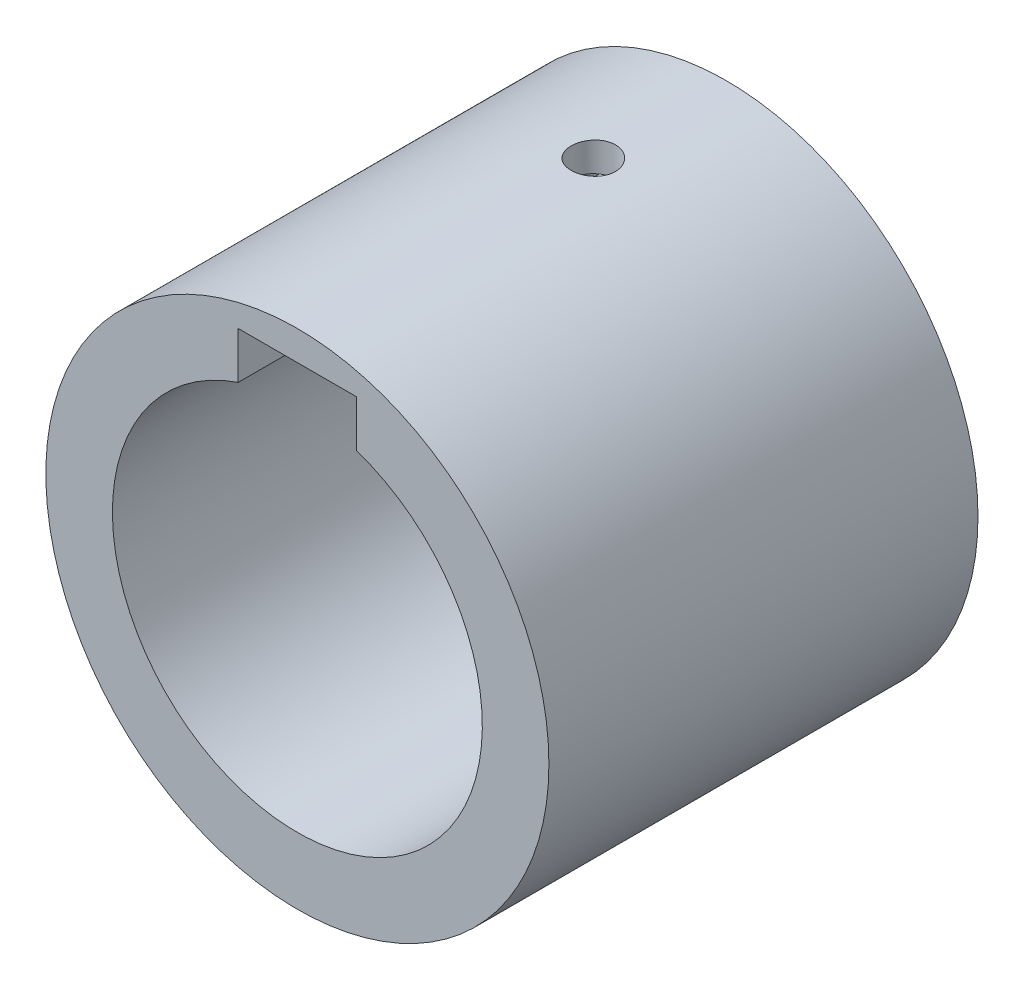
ISO-10303-21;
HEADER;
FILE_DESCRIPTION(('STEP AP214'),'2;1');
FILE_NAME('part.step','',(''),(''),'','','');
FILE_SCHEMA(('AUTOMOTIVE_DESIGN { 1 0 10303 214 1 1 1 1 }'));
ENDSEC;
DATA;
#1=APPLICATION_CONTEXT('core data for automotive mechanical design processes');
#2=APPLICATION_PROTOCOL_DEFINITION('international standard','automotive_design',2000,#1);
#3=PRODUCT_CONTEXT('',#1,'mechanical');
#4=PRODUCT('Part','Part','',(#3));
#5=PRODUCT_RELATED_PRODUCT_CATEGORY('part','',(#4));
#6=PRODUCT_DEFINITION_FORMATION('','',#4);
#7=PRODUCT_DEFINITION_CONTEXT('part definition',#1,'design');
#8=PRODUCT_DEFINITION('design','',#6,#7);
#9=PRODUCT_DEFINITION_SHAPE('','',#8);
#10=(LENGTH_UNIT() NAMED_UNIT(*) SI_UNIT(.MILLI.,.METRE.));
#11=(NAMED_UNIT(*) PLANE_ANGLE_UNIT() SI_UNIT($,.RADIAN.));
#12=(NAMED_UNIT(*) SI_UNIT($,.STERADIAN.) SOLID_ANGLE_UNIT());
#13=UNCERTAINTY_MEASURE_WITH_UNIT(LENGTH_MEASURE(1.E-05),#10,'distance_accuracy_value','');
#14=(GEOMETRIC_REPRESENTATION_CONTEXT(3) GLOBAL_UNCERTAINTY_ASSIGNED_CONTEXT((#13)) GLOBAL_UNIT_ASSIGNED_CONTEXT((#10,
#11,#12)) REPRESENTATION_CONTEXT('',''));
#15=CARTESIAN_POINT('',(0.,0.,0.));
#16=DIRECTION('',(0.,0.,1.));
#17=DIRECTION('',(1.,0.,0.));
#18=AXIS2_PLACEMENT_3D('',#15,#16,#17);
#19=CARTESIAN_POINT('',(0.,0.,29.));
#20=DIRECTION('',(0.,0.,1.));
#21=DIRECTION('',(1.,0.,0.));
#22=AXIS2_PLACEMENT_3D('',#19,#20,#21);
#23=PLANE('',#22);
#24=DIRECTION('',(0.,1.,0.));
#25=VECTOR('',#24,1.);
#26=CARTESIAN_POINT('',(4.,15.,29.));
#27=LINE('',#26,#25);
#28=CARTESIAN_POINT('',(4.,11.842719282327,29.));
#29=VERTEX_POINT('',#28);
#30=CARTESIAN_POINT('',(4.,15.,29.));
#31=VERTEX_POINT('',#30);
#32=EDGE_CURVE('E101',#29,#31,#27,.T.);
#33=ORIENTED_EDGE('',*,*,#32,.F.);
#34=CARTESIAN_POINT('',(0.,0.,29.));
#35=DIRECTION('',(0.,0.,1.));
#36=DIRECTION('',(1.,0.,0.));
#37=AXIS2_PLACEMENT_3D('',#34,#35,#36);
#38=CIRCLE('',#37,12.5);
#39=CARTESIAN_POINT('',(-4.,11.842719282327,29.));
#40=VERTEX_POINT('',#39);
#41=EDGE_CURVE('E120',#40,#29,#38,.T.);
#42=ORIENTED_EDGE('',*,*,#41,.F.);
#43=DIRECTION('',(0.,-1.,0.));
#44=VECTOR('',#43,1.);
#45=CARTESIAN_POINT('',(-4.,15.,29.));
#46=LINE('',#45,#44);
#47=CARTESIAN_POINT('',(-4.,15.,29.));
#48=VERTEX_POINT('',#47);
#49=EDGE_CURVE('E98',#48,#40,#46,.T.);
#50=ORIENTED_EDGE('',*,*,#49,.F.);
#51=DIRECTION('',(-1.,0.,0.));
#52=VECTOR('',#51,1.);
#53=CARTESIAN_POINT('',(-4.,15.,29.));
#54=LINE('',#53,#52);
#55=EDGE_CURVE('E94',#31,#48,#54,.T.);
#56=ORIENTED_EDGE('',*,*,#55,.F.);
#57=EDGE_LOOP('',(#33,#42,#50,#56));
#58=FACE_BOUND('',#57,.T.);
#59=CARTESIAN_POINT('',(0.,0.,29.));
#60=DIRECTION('',(0.,0.,1.));
#61=DIRECTION('',(1.,0.,0.));
#62=AXIS2_PLACEMENT_3D('',#59,#60,#61);
#63=CIRCLE('',#62,17.);
#64=CARTESIAN_POINT('',(17.,0.,29.));
#65=VERTEX_POINT('',#64);
#66=EDGE_CURVE('E127',#65,#65,#63,.T.);
#67=ORIENTED_EDGE('',*,*,#66,.T.);
#68=EDGE_LOOP('',(#67));
#69=FACE_BOUND('',#68,.T.);
#70=ADVANCED_FACE('F39',(#58,#69),#23,.T.);
#71=CARTESIAN_POINT('',(0.,0.,0.));
#72=DIRECTION('',(0.,0.,1.));
#73=DIRECTION('',(1.,0.,0.));
#74=AXIS2_PLACEMENT_3D('',#71,#72,#73);
#75=PLANE('',#74);
#76=CARTESIAN_POINT('',(0.,0.,0.));
#77=DIRECTION('',(0.,0.,1.));
#78=DIRECTION('',(1.,0.,0.));
#79=AXIS2_PLACEMENT_3D('',#76,#77,#78);
#80=CIRCLE('',#79,17.);
#81=CARTESIAN_POINT('',(17.,0.,0.));
#82=VERTEX_POINT('',#81);
#83=EDGE_CURVE('E123',#82,#82,#80,.T.);
#84=ORIENTED_EDGE('',*,*,#83,.F.);
#85=EDGE_LOOP('',(#84));
#86=FACE_BOUND('',#85,.T.);
#87=CARTESIAN_POINT('',(0.,0.,0.));
#88=DIRECTION('',(0.,0.,1.));
#89=DIRECTION('',(1.,0.,0.));
#90=AXIS2_PLACEMENT_3D('',#87,#88,#89);
#91=CIRCLE('',#90,12.5);
#92=CARTESIAN_POINT('',(12.5,0.,0.));
#93=VERTEX_POINT('',#92);
#94=EDGE_CURVE('E118',#93,#93,#91,.T.);
#95=ORIENTED_EDGE('',*,*,#94,.T.);
#96=EDGE_LOOP('',(#95));
#97=FACE_BOUND('',#96,.T.);
#98=ADVANCED_FACE('F171',(#86,#97),#75,.F.);
#99=CARTESIAN_POINT('',(0.,0.,29.));
#100=DIRECTION('',(0.,0.,-1.));
#101=DIRECTION('',(-1.,0.,0.));
#102=AXIS2_PLACEMENT_3D('',#99,#100,#101);
#103=CYLINDRICAL_SURFACE('',#102,17.);
#104=CARTESIAN_POINT('',(0.,17.,7.5));
#105=CARTESIAN_POINT('',(0.084080235866499,16.9999991366692,7.50000366418636));
#106=CARTESIAN_POINT('',(0.168217256556167,16.9993695779826,7.50709327184918));
#107=CARTESIAN_POINT('',(0.334162101229268,16.9969186756702,7.5352700015609));
#108=CARTESIAN_POINT('',(0.415967198426419,16.9950959921048,7.55637286158572));
#109=CARTESIAN_POINT('',(0.57482087522216,16.9904647505681,7.6119599618666));
#110=CARTESIAN_POINT('',(0.651872166635591,16.987656760896,7.64643648974169));
#111=CARTESIAN_POINT('',(0.79907619798614,16.9813695548534,7.72777813385308));
#112=CARTESIAN_POINT('',(0.869230380650741,16.9778904793125,7.77464065160849));
#113=CARTESIAN_POINT('',(1.00086587600031,16.9706402702899,7.87956736409582));
#114=CARTESIAN_POINT('',(1.06232489780315,16.9668684232275,7.93765947699702));
#115=CARTESIAN_POINT('',(1.17463411612825,16.9594637448475,8.06333717882862));
#116=CARTESIAN_POINT('',(1.22548383998342,16.9558309197295,8.13092319050832));
#117=CARTESIAN_POINT('',(1.31520757683625,16.9491080590586,8.27380656823702));
#118=CARTESIAN_POINT('',(1.35406181812048,16.9460189232131,8.34911639590942));
#119=CARTESIAN_POINT('',(1.4185653804641,16.9407415951097,8.50522291362321));
#120=CARTESIAN_POINT('',(1.44421496024304,16.9385533852002,8.58601949612724));
#121=CARTESIAN_POINT('',(1.48151599727451,16.9353318119117,8.75058136808518));
#122=CARTESIAN_POINT('',(1.49320398201809,16.9342954355067,8.83433831793839));
#123=CARTESIAN_POINT('',(1.50236291350133,16.9334854039232,9.0026310883707));
#124=CARTESIAN_POINT('',(1.49983415642455,16.9337117224385,9.08716689268695));
#125=CARTESIAN_POINT('',(1.48066155151999,16.9353987670437,9.25436698504778));
#126=CARTESIAN_POINT('',(1.46405745233263,16.9368560169532,9.33703587099868));
#127=CARTESIAN_POINT('',(1.41726727227211,16.9408352833957,9.49840881980152));
#128=CARTESIAN_POINT('',(1.38708104468567,16.9433573114304,9.57711283981501));
#129=CARTESIAN_POINT('',(1.31393915314471,16.949185966917,9.72844830583733));
#130=CARTESIAN_POINT('',(1.27096571042549,16.9524936854572,9.80107111546906));
#131=CARTESIAN_POINT('',(1.17348205158942,16.9595200433788,9.9380882040862));
#132=CARTESIAN_POINT('',(1.11897157314285,16.9632386921032,10.0024822959132));
#133=CARTESIAN_POINT('',(0.999738513125815,16.9706833852774,10.1214451161987));
#134=CARTESIAN_POINT('',(0.934981578037631,16.9744094114053,10.1759794201802));
#135=CARTESIAN_POINT('',(0.797213511535076,16.9814369213681,10.2734082934455));
#136=CARTESIAN_POINT('',(0.724202373686209,16.984738404872,10.3163028536556));
#137=CARTESIAN_POINT('',(0.571975637683146,16.9905455904275,10.3892326872116));
#138=CARTESIAN_POINT('',(0.492759275839949,16.9930511943361,10.4192663747941));
#139=CARTESIAN_POINT('',(0.330381291940771,16.996983221751,10.4655975051301));
#140=CARTESIAN_POINT('',(0.247219761738222,16.9984096703698,10.4818952675246));
#141=CARTESIAN_POINT('',(0.0796104030230985,17.0000194423459,10.500248612755));
#142=CARTESIAN_POINT('',(-0.00483218206200369,17.0002069148657,10.5023517320239));
#143=CARTESIAN_POINT('',(-0.172868703136019,16.9993287054252,10.4923807093475));
#144=CARTESIAN_POINT('',(-0.256462648005647,16.9982630365922,10.4803067159151));
#145=CARTESIAN_POINT('',(-0.420292963294034,16.9950010291973,10.4423636144201));
#146=CARTESIAN_POINT('',(-0.500534490142744,16.9928065018153,10.4165166018904));
#147=CARTESIAN_POINT('',(-0.655542086495679,16.9875332102989,10.3517837699911));
#148=CARTESIAN_POINT('',(-0.730308059307621,16.9844544305543,10.312897720434));
#149=CARTESIAN_POINT('',(-0.872458160373811,16.9777472136144,10.2230716196486));
#150=CARTESIAN_POINT('',(-0.939822365439243,16.9741173526791,10.172100147881));
#151=CARTESIAN_POINT('',(-1.06505544188414,16.9667203650642,10.059595390877));
#152=CARTESIAN_POINT('',(-1.12292412819998,16.9629532357112,9.99806189983917));
#153=CARTESIAN_POINT('',(-1.22768709603156,16.9556939504594,9.8659732195216));
#154=CARTESIAN_POINT('',(-1.27455030776123,16.9522025910796,9.79539333811737));
#155=CARTESIAN_POINT('',(-1.35575886575025,16.9459016871797,9.64733797843));
#156=CARTESIAN_POINT('',(-1.39010434989805,16.9430921351492,9.56986257611584));
#157=CARTESIAN_POINT('',(-1.44524983562932,16.9384775839307,9.41032447589277));
#158=CARTESIAN_POINT('',(-1.46606870960856,16.9366711856513,9.32826834349006));
#159=CARTESIAN_POINT('',(-1.49363139208435,16.9342628924147,9.16180849543857));
#160=CARTESIAN_POINT('',(-1.5003755073806,16.9336609712026,9.07740483100164));
#161=CARTESIAN_POINT('',(-1.49959349529965,16.9337302183425,8.90895460400024));
#162=CARTESIAN_POINT('',(-1.49211618154857,16.934397031893,8.82490780873638));
#163=CARTESIAN_POINT('',(-1.46320550589638,16.936919354309,8.65926884580703));
#164=CARTESIAN_POINT('',(-1.44177212409336,16.9387748648697,8.57767668164212));
#165=CARTESIAN_POINT('',(-1.38557040876227,16.9434643498395,8.41926090658646));
#166=CARTESIAN_POINT('',(-1.35080311320262,16.9462982480851,8.34243692506085));
#167=CARTESIAN_POINT('',(-1.2689258042702,16.9526253396978,8.19570795251622));
#168=CARTESIAN_POINT('',(-1.22181595011684,16.9561185245598,8.12580287225918));
#169=CARTESIAN_POINT('',(-1.11640728077523,16.9633848931066,7.9946460642531));
#170=CARTESIAN_POINT('',(-1.05807223244496,16.9671589585558,7.93342350521638));
#171=CARTESIAN_POINT('',(-0.931936963261484,16.9745537766173,7.82161248595841));
#172=CARTESIAN_POINT('',(-0.864134462128934,16.97817449202,7.77102659500461));
#173=CARTESIAN_POINT('',(-0.720843098972521,16.9848619761362,7.68184832527082));
#174=CARTESIAN_POINT('',(-0.645338844429667,16.9879276001517,7.64328061473432));
#175=CARTESIAN_POINT('',(-0.488949731353307,16.9931463894423,7.57942043598088));
#176=CARTESIAN_POINT('',(-0.408071145215391,16.9953005975204,7.55411278821875));
#177=CARTESIAN_POINT('',(-0.272267186189503,16.9979040364892,7.52389947417437));
#178=CARTESIAN_POINT('',(-0.218213808395125,16.9986864208092,7.51494917473601));
#179=CARTESIAN_POINT('',(-0.109448307539669,16.9997346827935,7.50299825400015));
#180=CARTESIAN_POINT('',(-0.0547361864815629,17.0000005620279,7.49999761461673));
#181=CARTESIAN_POINT('',(0.,17.,7.5));
#182=B_SPLINE_CURVE_WITH_KNOTS('',3,(#104,#105,#106,#107,#108,#109,#110,#111,#112,#113,#114,
#115,#116,#117,#118,#119,#120,#121,#122,#123,#124,#125,#126,#127,#128,#129,#130,#131,#132,#133,
#134,#135,#136,#137,#138,#139,#140,#141,#142,#143,#144,#145,#146,#147,#148,#149,#150,#151,#152,
#153,#154,#155,#156,#157,#158,#159,#160,#161,#162,#163,#164,#165,#166,#167,#168,#169,#170,#171,
#172,#173,#174,#175,#176,#177,#178,#179,#180,#181),.UNSPECIFIED.,.T.,.F.,(4,2,2,2,2,2,2,2,2,2,2,
2,2,2,2,2,2,2,2,2,2,2,2,2,2,2,2,2,2,2,2,2,2,2,2,2,2,2,4),(0.,0.252040852757285,
0.504365246877549,0.756544345352494,1.00867058061988,1.26143188749012,1.51420445301807,
1.76739145693377,2.02057349995601,2.27309168593404,2.52560461111023,2.77740680852379,
3.02921172595373,3.28136839051263,3.53353078923872,3.78655726723963,4.03958394248665,
4.2926418072939,4.54569378316716,4.79789789108671,5.05009935705509,5.30189743849976,
5.55369996535094,5.80616446692186,6.05863388833423,6.31180771599295,6.5649787547431,
6.81779580511231,7.07060734455154,7.32255269951577,7.57449841376498,7.82642451947049,
8.07834737548102,8.33109746875406,8.58390854338802,8.83723516529166,9.09027115274212,
9.25435010556812,9.4184285596224),.UNSPECIFIED.);
#183=CARTESIAN_POINT('',(0.,17.,7.5));
#184=VERTEX_POINT('',#183);
#185=EDGE_CURVE('E108',#184,#184,#182,.T.);
#186=ORIENTED_EDGE('',*,*,#185,.T.);
#187=EDGE_LOOP('',(#186));
#188=FACE_BOUND('',#187,.T.);
#189=ORIENTED_EDGE('',*,*,#66,.F.);
#190=EDGE_LOOP('',(#189));
#191=FACE_BOUND('',#190,.T.);
#192=ORIENTED_EDGE('',*,*,#83,.T.);
#193=EDGE_LOOP('',(#192));
#194=FACE_BOUND('',#193,.T.);
#195=ADVANCED_FACE('F165',(#188,#191,#194),#103,.T.);
#196=CARTESIAN_POINT('',(0.,0.,29.));
#197=DIRECTION('',(0.,0.,-1.));
#198=DIRECTION('',(-1.,0.,0.));
#199=AXIS2_PLACEMENT_3D('',#196,#197,#198);
#200=CYLINDRICAL_SURFACE('',#199,12.5);
#201=DIRECTION('',(0.,0.,-1.));
#202=VECTOR('',#201,1.);
#203=CARTESIAN_POINT('',(4.,11.842719282327,29.));
#204=LINE('',#203,#202);
#205=CARTESIAN_POINT('',(4.,11.842719282327,5.00000000000001));
#206=VERTEX_POINT('',#205);
#207=EDGE_CURVE('E103',#206,#29,#204,.F.);
#208=ORIENTED_EDGE('',*,*,#207,.F.);
#209=CARTESIAN_POINT('',(4.,11.842719282327,5.));
#210=CARTESIAN_POINT('',(4.000014108109,11.8427027339755,4.89059636171616));
#211=CARTESIAN_POINT('',(3.99551185845152,11.8442349122454,4.78120205499023));
#212=CARTESIAN_POINT('',(3.9775844837482,11.8502736233182,4.56325638765238));
#213=CARTESIAN_POINT('',(3.96416160072662,11.854779408762,4.45470482216764));
#214=CARTESIAN_POINT('',(3.92855348505471,11.8666254544735,4.23952006158545));
#215=CARTESIAN_POINT('',(3.90639332086803,11.8739576041807,4.13288228279245));
#216=CARTESIAN_POINT('',(3.85353363666251,11.8912172031461,3.9219869722879));
#217=CARTESIAN_POINT('',(3.82283384420883,11.9011447352028,3.81772951662926));
#218=CARTESIAN_POINT('',(3.718318870469,11.9343836990322,3.50969856529468));
#219=CARTESIAN_POINT('',(3.63203852195166,11.9611690495956,3.31037039083053));
#220=CARTESIAN_POINT('',(3.42895419959732,12.0209572470146,2.92899377034352));
#221=CARTESIAN_POINT('',(3.31213229140892,12.0539637438097,2.74695556309615));
#222=CARTESIAN_POINT('',(3.04678704404777,12.1237979735197,2.39874823821929));
#223=CARTESIAN_POINT('',(2.89735786560396,12.1607149594796,2.23328592176409));
#224=CARTESIAN_POINT('',(2.57296775676279,12.2334551958654,1.92928848197738));
#225=CARTESIAN_POINT('',(2.39800175774104,12.2692782274491,1.79075871705836));
#226=CARTESIAN_POINT('',(2.0223146195578,12.3368352813414,1.54134569724348));
#227=CARTESIAN_POINT('',(1.82107360503249,12.368449683863,1.43121076597351));
#228=CARTESIAN_POINT('',(1.40181825899296,12.4229393112523,1.24670154049558));
#229=CARTESIAN_POINT('',(1.18381941229534,12.4458224901711,1.17229468234535));
#230=CARTESIAN_POINT('',(0.803985831746464,12.4751119932894,1.07830109729569));
#231=CARTESIAN_POINT('',(0.644727230452247,12.4843945149166,1.04899218947815));
#232=CARTESIAN_POINT('',(0.403957039842505,12.4937296832455,1.01962795718819));
#233=CARTESIAN_POINT('',(0.323378306998399,12.4960766422612,1.01227306267437));
#234=CARTESIAN_POINT('',(0.161871929582104,12.4992135584394,1.0024572355341));
#235=CARTESIAN_POINT('',(0.0809441986002887,12.5000031048325,0.999997594034592));
#236=CARTESIAN_POINT('',(0.,12.5,1.));
#237=B_SPLINE_CURVE_WITH_KNOTS('',3,(#209,#210,#211,#212,#213,#214,#215,#216,#217,#218,#219,
#220,#221,#222,#223,#224,#225,#226,#227,#228,#229,#230,#231,#232,#233,#234,#235,#236),
.UNSPECIFIED.,.F.,.F.,(4,2,2,2,2,2,2,2,2,2,2,2,2,4),(0.,0.328091770468165,0.656101112745641,
0.98317612048242,1.31026156390166,1.96354160539607,2.61720612537755,3.29208589654353,
3.96709980248513,4.65841267442313,5.34909425550849,5.83438547801586,6.0770804420846,
6.31983940866816),.UNSPECIFIED.);
#238=CARTESIAN_POINT('',(0.,12.5,1.));
#239=VERTEX_POINT('',#238);
#240=EDGE_CURVE('E11',#206,#239,#237,.T.);
#241=ORIENTED_EDGE('',*,*,#240,.T.);
#242=CARTESIAN_POINT('',(0.,12.5,1.));
#243=CARTESIAN_POINT('',(-0.109548843055563,12.5000135241496,0.999986231927838));
#244=CARTESIAN_POINT('',(-0.219089179829054,12.4985602037462,1.00450009597459));
#245=CARTESIAN_POINT('',(-0.437335319378228,12.4928204487121,1.0224762059725));
#246=CARTESIAN_POINT('',(-0.546041298021536,12.4885346286904,1.03593651068682));
#247=CARTESIAN_POINT('',(-0.761564352073815,12.4772453001583,1.07165146676037));
#248=CARTESIAN_POINT('',(-0.868385658925627,12.4702490011672,1.09388279121332));
#249=CARTESIAN_POINT('',(-1.07965081037489,12.4537385192051,1.14691918869117));
#250=CARTESIAN_POINT('',(-1.18409459919728,12.4442242772307,1.17772446263173));
#251=CARTESIAN_POINT('',(-1.49271252448845,12.4122677732389,1.28262173648775));
#252=CARTESIAN_POINT('',(-1.69243598108249,12.3863970696334,1.36923921994358));
#253=CARTESIAN_POINT('',(-2.07447334136003,12.3281815087559,1.57311285326465));
#254=CARTESIAN_POINT('',(-2.25677868877864,12.2958334935543,1.6903839564566));
#255=CARTESIAN_POINT('',(-2.60471966331112,12.2269285617351,1.95620194290991));
#256=CARTESIAN_POINT('',(-2.76972318606702,12.1902771900345,2.10555302560561));
#257=CARTESIAN_POINT('',(-3.0728262415286,12.1174297405664,2.42959416773484));
#258=CARTESIAN_POINT('',(-3.21091810997508,12.0812337952389,2.6042914209493));
#259=CARTESIAN_POINT('',(-3.45982992985265,12.0123573431981,2.9796974030544));
#260=CARTESIAN_POINT('',(-3.56983175666177,11.9797951697797,3.18097200074156));
#261=CARTESIAN_POINT('',(-3.75407995114595,11.9233493325661,3.60028329302975));
#262=CARTESIAN_POINT('',(-3.82836237010401,11.8994569244569,3.81830282820061));
#263=CARTESIAN_POINT('',(-3.92204838733121,11.8688303229517,4.19780486205675));
#264=CARTESIAN_POINT('',(-3.95122217579471,11.8591011849465,4.35668417332164));
#265=CARTESIAN_POINT('',(-3.9804557635215,11.8493067289986,4.59690439341059));
#266=CARTESIAN_POINT('',(-3.98777912024922,11.8468417738811,4.6773095787556));
#267=CARTESIAN_POINT('',(-3.99755315040078,11.8435459080891,4.83847091527657));
#268=CARTESIAN_POINT('',(-4.00000248551678,11.8427154462141,4.91922715674696));
#269=CARTESIAN_POINT('',(-4.,11.842719282327,5.));
#270=B_SPLINE_CURVE_WITH_KNOTS('',3,(#242,#243,#244,#245,#246,#247,#248,#249,#250,#251,#252,
#253,#254,#255,#256,#257,#258,#259,#260,#261,#262,#263,#264,#265,#266,#267,#268,#269),
.UNSPECIFIED.,.F.,.F.,(4,2,2,2,2,2,2,2,2,2,2,2,2,4),(0.,0.328529425061734,0.65698758766955,
0.984578027265163,1.31217614402192,1.9665819645771,2.62130761247084,3.29490875477789,
3.96870145473827,4.6603193427618,5.35123771413171,5.83541629623547,6.07759432927719,
6.31983885034184),.UNSPECIFIED.);
#271=CARTESIAN_POINT('',(-4.,11.842719282327,5.00000000000001));
#272=VERTEX_POINT('',#271);
#273=EDGE_CURVE('E150',#239,#272,#270,.T.);
#274=ORIENTED_EDGE('',*,*,#273,.T.);
#275=DIRECTION('',(0.,0.,-1.));
#276=VECTOR('',#275,1.);
#277=CARTESIAN_POINT('',(-4.,11.842719282327,29.));
#278=LINE('',#277,#276);
#279=EDGE_CURVE('E131',#40,#272,#278,.T.);
#280=ORIENTED_EDGE('',*,*,#279,.F.);
#281=ORIENTED_EDGE('',*,*,#41,.T.);
#282=EDGE_LOOP('',(#208,#241,#274,#280,#281));
#283=FACE_BOUND('',#282,.T.);
#284=ORIENTED_EDGE('',*,*,#94,.F.);
#285=EDGE_LOOP('',(#284));
#286=FACE_BOUND('',#285,.T.);
#287=ADVANCED_FACE('F160',(#283,#286),#200,.F.);
#288=CARTESIAN_POINT('',(4.,15.,1.));
#289=DIRECTION('',(1.,0.,0.));
#290=DIRECTION('',(0.,1.,0.));
#291=AXIS2_PLACEMENT_3D('',#288,#289,#290);
#292=PLANE('',#291);
#293=DIRECTION('',(0.,0.,1.));
#294=VECTOR('',#293,1.);
#295=CARTESIAN_POINT('',(4.,15.,1.));
#296=LINE('',#295,#294);
#297=CARTESIAN_POINT('',(4.,15.,5.));
#298=VERTEX_POINT('',#297);
#299=EDGE_CURVE('E89',#298,#31,#296,.T.);
#300=ORIENTED_EDGE('',*,*,#299,.F.);
#301=DIRECTION('',(0.,1.,0.));
#302=VECTOR('',#301,1.);
#303=CARTESIAN_POINT('',(4.,15.,5.));
#304=LINE('',#303,#302);
#305=EDGE_CURVE('E54',#298,#206,#304,.F.);
#306=ORIENTED_EDGE('',*,*,#305,.T.);
#307=ORIENTED_EDGE('',*,*,#207,.T.);
#308=ORIENTED_EDGE('',*,*,#32,.T.);
#309=EDGE_LOOP('',(#300,#306,#307,#308));
#310=FACE_BOUND('',#309,.T.);
#311=ADVANCED_FACE('F102',(#310),#292,.F.);
#312=CARTESIAN_POINT('',(-4.,15.,1.));
#313=DIRECTION('',(-1.,0.,0.));
#314=DIRECTION('',(0.,-1.,0.));
#315=AXIS2_PLACEMENT_3D('',#312,#313,#314);
#316=PLANE('',#315);
#317=ORIENTED_EDGE('',*,*,#279,.T.);
#318=DIRECTION('',(0.,-1.,0.));
#319=VECTOR('',#318,1.);
#320=CARTESIAN_POINT('',(-4.,15.,5.));
#321=LINE('',#320,#319);
#322=CARTESIAN_POINT('',(-4.,15.,5.));
#323=VERTEX_POINT('',#322);
#324=EDGE_CURVE('E144',#272,#323,#321,.F.);
#325=ORIENTED_EDGE('',*,*,#324,.T.);
#326=DIRECTION('',(0.,0.,1.));
#327=VECTOR('',#326,1.);
#328=CARTESIAN_POINT('',(-4.,15.,1.));
#329=LINE('',#328,#327);
#330=EDGE_CURVE('E97',#323,#48,#329,.T.);
#331=ORIENTED_EDGE('',*,*,#330,.T.);
#332=ORIENTED_EDGE('',*,*,#49,.T.);
#333=EDGE_LOOP('',(#317,#325,#331,#332));
#334=FACE_BOUND('',#333,.T.);
#335=ADVANCED_FACE('F190',(#334),#316,.F.);
#336=CARTESIAN_POINT('',(-4.,15.,1.));
#337=DIRECTION('',(0.,1.,0.));
#338=DIRECTION('',(0.,0.,1.));
#339=AXIS2_PLACEMENT_3D('',#336,#337,#338);
#340=PLANE('',#339);
#341=CARTESIAN_POINT('',(0.,15.,9.));
#342=DIRECTION('',(0.,-1.,0.));
#343=DIRECTION('',(0.,0.,-1.));
#344=AXIS2_PLACEMENT_3D('',#341,#342,#343);
#345=CIRCLE('',#344,1.5);
#346=CARTESIAN_POINT('',(0.,15.,7.5));
#347=VERTEX_POINT('',#346);
#348=EDGE_CURVE('E184',#347,#347,#345,.T.);
#349=ORIENTED_EDGE('',*,*,#348,.F.);
#350=EDGE_LOOP('',(#349));
#351=FACE_BOUND('',#350,.T.);
#352=CARTESIAN_POINT('',(0.,15.,5.));
#353=DIRECTION('',(0.,1.,0.));
#354=DIRECTION('',(0.,0.,1.));
#355=AXIS2_PLACEMENT_3D('',#352,#353,#354);
#356=CIRCLE('',#355,4.);
#357=CARTESIAN_POINT('',(0.,15.,1.));
#358=VERTEX_POINT('',#357);
#359=EDGE_CURVE('E147',#323,#358,#356,.F.);
#360=ORIENTED_EDGE('',*,*,#359,.T.);
#361=CARTESIAN_POINT('',(0.,15.,5.));
#362=DIRECTION('',(0.,1.,0.));
#363=DIRECTION('',(0.,0.,1.));
#364=AXIS2_PLACEMENT_3D('',#361,#362,#363);
#365=CIRCLE('',#364,4.);
#366=EDGE_CURVE('E68',#358,#298,#365,.F.);
#367=ORIENTED_EDGE('',*,*,#366,.T.);
#368=ORIENTED_EDGE('',*,*,#299,.T.);
#369=ORIENTED_EDGE('',*,*,#55,.T.);
#370=ORIENTED_EDGE('',*,*,#330,.F.);
#371=EDGE_LOOP('',(#360,#367,#368,#369,#370));
#372=FACE_BOUND('',#371,.T.);
#373=ADVANCED_FACE('F91',(#351,#372),#340,.F.);
#374=CARTESIAN_POINT('',(0.,0.,5.));
#375=DIRECTION('',(0.,-1.,0.));
#376=DIRECTION('',(1.,0.,0.));
#377=AXIS2_PLACEMENT_3D('',#374,#375,#376);
#378=CYLINDRICAL_SURFACE('',#377,4.);
#379=ORIENTED_EDGE('',*,*,#359,.F.);
#380=ORIENTED_EDGE('',*,*,#324,.F.);
#381=ORIENTED_EDGE('',*,*,#273,.F.);
#382=DIRECTION('',(0.,-1.,0.));
#383=VECTOR('',#382,1.);
#384=CARTESIAN_POINT('',(0.,0.,1.));
#385=LINE('',#384,#383);
#386=EDGE_CURVE('E140',#358,#239,#385,.T.);
#387=ORIENTED_EDGE('',*,*,#386,.F.);
#388=EDGE_LOOP('',(#379,#380,#381,#387));
#389=FACE_BOUND('',#388,.T.);
#390=ADVANCED_FACE('F157',(#389),#378,.F.);
#391=CARTESIAN_POINT('',(0.,0.,5.));
#392=DIRECTION('',(0.,1.,0.));
#393=DIRECTION('',(-1.,0.,0.));
#394=AXIS2_PLACEMENT_3D('',#391,#392,#393);
#395=CYLINDRICAL_SURFACE('',#394,4.);
#396=ORIENTED_EDGE('',*,*,#240,.F.);
#397=ORIENTED_EDGE('',*,*,#305,.F.);
#398=ORIENTED_EDGE('',*,*,#366,.F.);
#399=ORIENTED_EDGE('',*,*,#386,.T.);
#400=EDGE_LOOP('',(#396,#397,#398,#399));
#401=FACE_BOUND('',#400,.T.);
#402=ADVANCED_FACE('F41',(#401),#395,.F.);
#403=CARTESIAN_POINT('',(0.,17.,9.));
#404=DIRECTION('',(0.,-1.,0.));
#405=DIRECTION('',(0.,0.,-1.));
#406=AXIS2_PLACEMENT_3D('',#403,#404,#405);
#407=CYLINDRICAL_SURFACE('',#406,1.5);
#408=ORIENTED_EDGE('',*,*,#348,.T.);
#409=EDGE_LOOP('',(#408));
#410=FACE_BOUND('',#409,.T.);
#411=ORIENTED_EDGE('',*,*,#185,.F.);
#412=EDGE_LOOP('',(#411));
#413=FACE_BOUND('',#412,.T.);
#414=ADVANCED_FACE('F185',(#410,#413),#407,.F.);
#415=CLOSED_SHELL('',(#70,#98,#195,#287,#311,#335,#373,#390,#402,#414));
#416=MANIFOLD_SOLID_BREP('B2',#415);
#417=ADVANCED_BREP_SHAPE_REPRESENTATION('',(#18,#416),#14);
#418=SHAPE_DEFINITION_REPRESENTATION(#9,#417);
ENDSEC;
END-ISO-10303-21;
